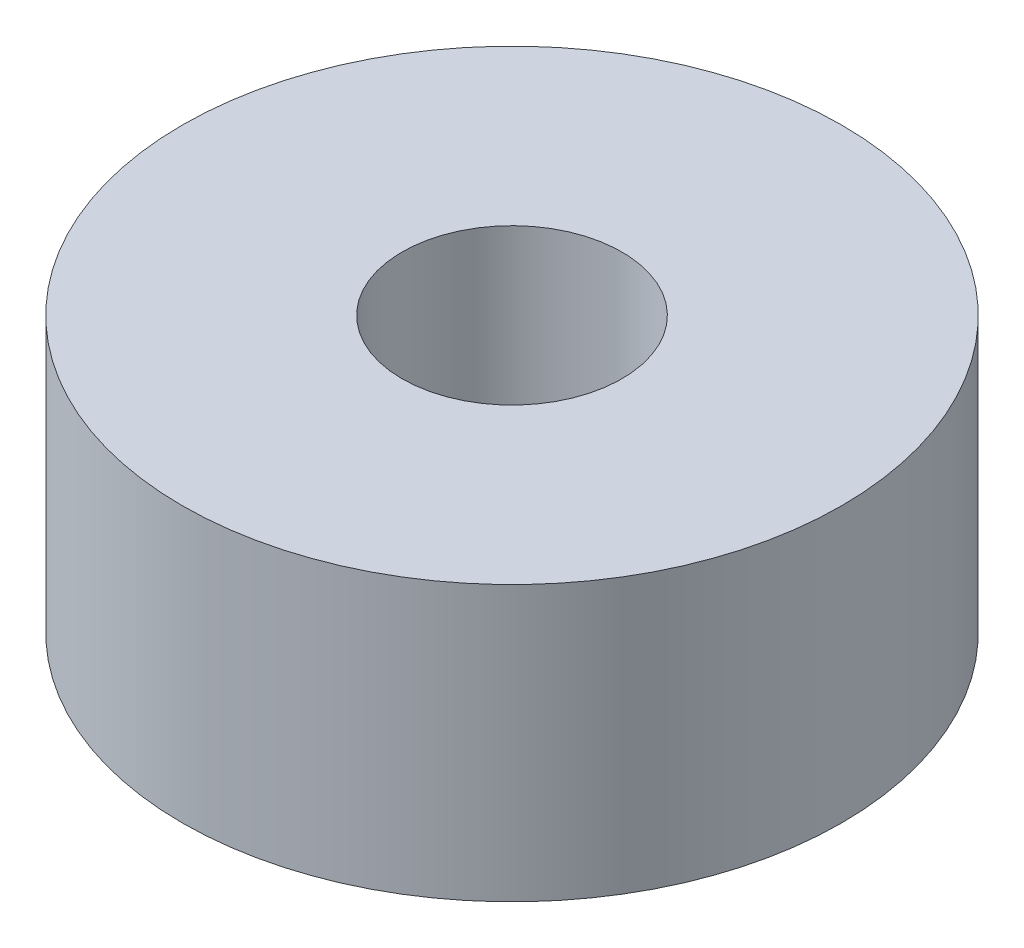
ISO-10303-21;
HEADER;
FILE_DESCRIPTION(('STEP AP214'),'2;1');
FILE_NAME('part.step','',(''),(''),'','','');
FILE_SCHEMA(('AUTOMOTIVE_DESIGN { 1 0 10303 214 1 1 1 1 }'));
ENDSEC;
DATA;
#1=APPLICATION_CONTEXT('core data for automotive mechanical design processes');
#2=APPLICATION_PROTOCOL_DEFINITION('international standard','automotive_design',2000,#1);
#3=PRODUCT_CONTEXT('',#1,'mechanical');
#4=PRODUCT('Part','Part','',(#3));
#5=PRODUCT_RELATED_PRODUCT_CATEGORY('part','',(#4));
#6=PRODUCT_DEFINITION_FORMATION('','',#4);
#7=PRODUCT_DEFINITION_CONTEXT('part definition',#1,'design');
#8=PRODUCT_DEFINITION('design','',#6,#7);
#9=PRODUCT_DEFINITION_SHAPE('','',#8);
#10=(LENGTH_UNIT() NAMED_UNIT(*) SI_UNIT(.MILLI.,.METRE.));
#11=(NAMED_UNIT(*) PLANE_ANGLE_UNIT() SI_UNIT($,.RADIAN.));
#12=(NAMED_UNIT(*) SI_UNIT($,.STERADIAN.) SOLID_ANGLE_UNIT());
#13=UNCERTAINTY_MEASURE_WITH_UNIT(LENGTH_MEASURE(1.E-05),#10,'distance_accuracy_value','');
#14=(GEOMETRIC_REPRESENTATION_CONTEXT(3) GLOBAL_UNCERTAINTY_ASSIGNED_CONTEXT((#13)) GLOBAL_UNIT_ASSIGNED_CONTEXT((#10,
#11,#12)) REPRESENTATION_CONTEXT('',''));
#15=CARTESIAN_POINT('',(0.,0.,0.));
#16=DIRECTION('',(0.,0.,1.));
#17=DIRECTION('',(1.,0.,0.));
#18=AXIS2_PLACEMENT_3D('',#15,#16,#17);
#19=CARTESIAN_POINT('',(0.,2.5,0.));
#20=DIRECTION('',(0.,1.,0.));
#21=DIRECTION('',(0.,0.,1.));
#22=AXIS2_PLACEMENT_3D('',#19,#20,#21);
#23=PLANE('',#22);
#24=CARTESIAN_POINT('',(0.,2.5,0.));
#25=DIRECTION('',(0.,1.,0.));
#26=DIRECTION('',(0.,0.,1.));
#27=AXIS2_PLACEMENT_3D('',#24,#25,#26);
#28=CIRCLE('',#27,3.);
#29=CARTESIAN_POINT('',(0.,2.5,3.));
#30=VERTEX_POINT('',#29);
#31=EDGE_CURVE('E10',#30,#30,#28,.T.);
#32=ORIENTED_EDGE('',*,*,#31,.T.);
#33=EDGE_LOOP('',(#32));
#34=FACE_BOUND('',#33,.T.);
#35=CARTESIAN_POINT('',(0.,2.5,0.));
#36=DIRECTION('',(0.,1.,0.));
#37=DIRECTION('',(0.,0.,1.));
#38=AXIS2_PLACEMENT_3D('',#35,#36,#37);
#39=CIRCLE('',#38,1.);
#40=CARTESIAN_POINT('',(0.,2.5,1.));
#41=VERTEX_POINT('',#40);
#42=EDGE_CURVE('E45',#41,#41,#39,.T.);
#43=ORIENTED_EDGE('',*,*,#42,.F.);
#44=EDGE_LOOP('',(#43));
#45=FACE_BOUND('',#44,.T.);
#46=ADVANCED_FACE('F34',(#34,#45),#23,.T.);
#47=CARTESIAN_POINT('',(0.,0.,0.));
#48=DIRECTION('',(0.,1.,0.));
#49=DIRECTION('',(0.,0.,1.));
#50=AXIS2_PLACEMENT_3D('',#47,#48,#49);
#51=PLANE('',#50);
#52=CARTESIAN_POINT('',(0.,0.,0.));
#53=DIRECTION('',(0.,1.,0.));
#54=DIRECTION('',(0.,0.,1.));
#55=AXIS2_PLACEMENT_3D('',#52,#53,#54);
#56=CIRCLE('',#55,3.);
#57=CARTESIAN_POINT('',(0.,0.,3.));
#58=VERTEX_POINT('',#57);
#59=EDGE_CURVE('E38',#58,#58,#56,.T.);
#60=ORIENTED_EDGE('',*,*,#59,.F.);
#61=EDGE_LOOP('',(#60));
#62=FACE_BOUND('',#61,.T.);
#63=CARTESIAN_POINT('',(0.,0.,0.));
#64=DIRECTION('',(0.,1.,0.));
#65=DIRECTION('',(0.,0.,1.));
#66=AXIS2_PLACEMENT_3D('',#63,#64,#65);
#67=CIRCLE('',#66,1.);
#68=CARTESIAN_POINT('',(0.,0.,1.));
#69=VERTEX_POINT('',#68);
#70=EDGE_CURVE('E47',#69,#69,#67,.T.);
#71=ORIENTED_EDGE('',*,*,#70,.T.);
#72=EDGE_LOOP('',(#71));
#73=FACE_BOUND('',#72,.T.);
#74=ADVANCED_FACE('F57',(#62,#73),#51,.F.);
#75=CARTESIAN_POINT('',(0.,2.5,0.));
#76=DIRECTION('',(0.,-1.,0.));
#77=DIRECTION('',(0.,0.,-1.));
#78=AXIS2_PLACEMENT_3D('',#75,#76,#77);
#79=CYLINDRICAL_SURFACE('',#78,3.);
#80=ORIENTED_EDGE('',*,*,#31,.F.);
#81=EDGE_LOOP('',(#80));
#82=FACE_BOUND('',#81,.T.);
#83=ORIENTED_EDGE('',*,*,#59,.T.);
#84=EDGE_LOOP('',(#83));
#85=FACE_BOUND('',#84,.T.);
#86=ADVANCED_FACE('F36',(#82,#85),#79,.T.);
#87=CARTESIAN_POINT('',(0.,2.5,0.));
#88=DIRECTION('',(0.,-1.,0.));
#89=DIRECTION('',(0.,0.,-1.));
#90=AXIS2_PLACEMENT_3D('',#87,#88,#89);
#91=CYLINDRICAL_SURFACE('',#90,1.);
#92=ORIENTED_EDGE('',*,*,#42,.T.);
#93=EDGE_LOOP('',(#92));
#94=FACE_BOUND('',#93,.T.);
#95=ORIENTED_EDGE('',*,*,#70,.F.);
#96=EDGE_LOOP('',(#95));
#97=FACE_BOUND('',#96,.T.);
#98=ADVANCED_FACE('F53',(#94,#97),#91,.F.);
#99=CLOSED_SHELL('',(#46,#74,#86,#98));
#100=MANIFOLD_SOLID_BREP('B2',#99);
#101=ADVANCED_BREP_SHAPE_REPRESENTATION('',(#18,#100),#14);
#102=SHAPE_DEFINITION_REPRESENTATION(#9,#101);
ENDSEC;
END-ISO-10303-21;
